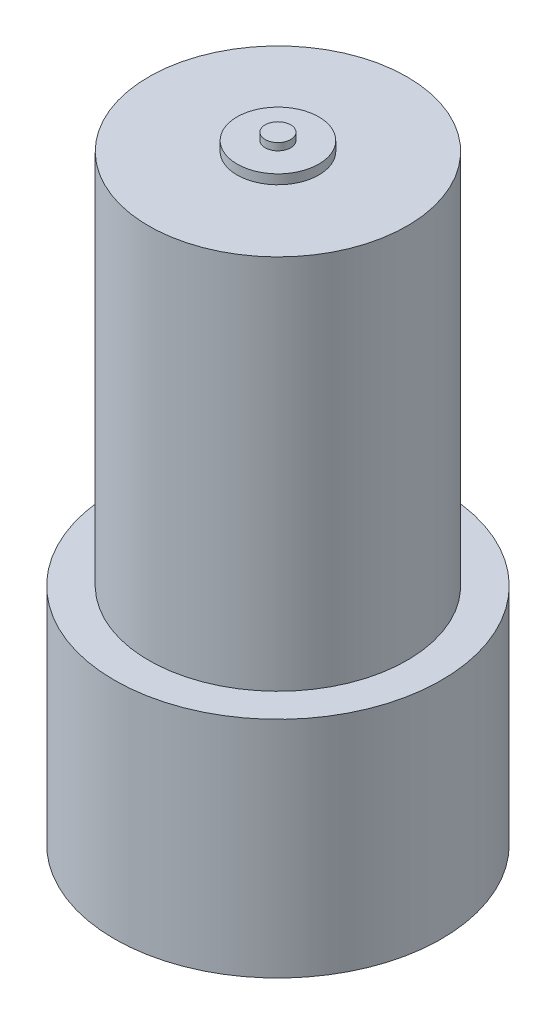
ISO-10303-21;
HEADER;
FILE_DESCRIPTION(('STEP AP214'),'2;1');
FILE_NAME('part.step','',(''),(''),'','','');
FILE_SCHEMA(('AUTOMOTIVE_DESIGN { 1 0 10303 214 1 1 1 1 }'));
ENDSEC;
DATA;
#1=APPLICATION_CONTEXT('core data for automotive mechanical design processes');
#2=APPLICATION_PROTOCOL_DEFINITION('international standard','automotive_design',2000,#1);
#3=PRODUCT_CONTEXT('',#1,'mechanical');
#4=PRODUCT('Part','Part','',(#3));
#5=PRODUCT_RELATED_PRODUCT_CATEGORY('part','',(#4));
#6=PRODUCT_DEFINITION_FORMATION('','',#4);
#7=PRODUCT_DEFINITION_CONTEXT('part definition',#1,'design');
#8=PRODUCT_DEFINITION('design','',#6,#7);
#9=PRODUCT_DEFINITION_SHAPE('','',#8);
#10=(LENGTH_UNIT() NAMED_UNIT(*) SI_UNIT(.MILLI.,.METRE.));
#11=(NAMED_UNIT(*) PLANE_ANGLE_UNIT() SI_UNIT($,.RADIAN.));
#12=(NAMED_UNIT(*) SI_UNIT($,.STERADIAN.) SOLID_ANGLE_UNIT());
#13=UNCERTAINTY_MEASURE_WITH_UNIT(LENGTH_MEASURE(1.E-05),#10,'distance_accuracy_value','');
#14=(GEOMETRIC_REPRESENTATION_CONTEXT(3) GLOBAL_UNCERTAINTY_ASSIGNED_CONTEXT((#13)) GLOBAL_UNIT_ASSIGNED_CONTEXT((#10,
#11,#12)) REPRESENTATION_CONTEXT('',''));
#15=CARTESIAN_POINT('',(0.,0.,0.));
#16=DIRECTION('',(0.,0.,1.));
#17=DIRECTION('',(1.,0.,0.));
#18=AXIS2_PLACEMENT_3D('',#15,#16,#17);
#19=CARTESIAN_POINT('',(0.,-1.524,0.));
#20=DIRECTION('',(0.,-1.,0.));
#21=DIRECTION('',(0.,0.,-1.));
#22=AXIS2_PLACEMENT_3D('',#19,#20,#21);
#23=PLANE('',#22);
#24=CARTESIAN_POINT('',(0.,-1.524,0.));
#25=DIRECTION('',(0.,-1.,0.));
#26=DIRECTION('',(0.,0.,-1.));
#27=AXIS2_PLACEMENT_3D('',#24,#25,#26);
#28=CIRCLE('',#27,14.224);
#29=CARTESIAN_POINT('',(0.,-1.524,14.224));
#30=VERTEX_POINT('',#29);
#31=EDGE_CURVE('E83',#30,#30,#28,.T.);
#32=ORIENTED_EDGE('',*,*,#31,.T.);
#33=EDGE_LOOP('',(#32));
#34=FACE_BOUND('',#33,.T.);
#35=CARTESIAN_POINT('',(-4.1783,-1.524,0.));
#36=DIRECTION('',(0.,-1.,0.));
#37=DIRECTION('',(0.,0.,-1.));
#38=AXIS2_PLACEMENT_3D('',#35,#36,#37);
#39=CIRCLE('',#38,2.9464);
#40=CARTESIAN_POINT('',(-4.1783,-1.524,-2.9464));
#41=VERTEX_POINT('',#40);
#42=EDGE_CURVE('E38',#41,#41,#39,.F.);
#43=ORIENTED_EDGE('',*,*,#42,.T.);
#44=EDGE_LOOP('',(#43));
#45=FACE_BOUND('',#44,.T.);
#46=ADVANCED_FACE('F34',(#34,#45),#23,.T.);
#47=CARTESIAN_POINT('',(0.,94.6912,0.));
#48=DIRECTION('',(0.,1.,0.));
#49=DIRECTION('',(0.,0.,1.));
#50=AXIS2_PLACEMENT_3D('',#47,#48,#49);
#51=PLANE('',#50);
#52=CARTESIAN_POINT('',(0.,94.6912,0.));
#53=DIRECTION('',(0.,1.,0.));
#54=DIRECTION('',(0.,0.,1.));
#55=AXIS2_PLACEMENT_3D('',#52,#53,#54);
#56=CIRCLE('',#55,6.35);
#57=CARTESIAN_POINT('',(0.,94.6912,6.35));
#58=VERTEX_POINT('',#57);
#59=EDGE_CURVE('E80',#58,#58,#56,.T.);
#60=ORIENTED_EDGE('',*,*,#59,.T.);
#61=EDGE_LOOP('',(#60));
#62=FACE_BOUND('',#61,.T.);
#63=CARTESIAN_POINT('',(0.,94.6912,0.));
#64=DIRECTION('',(0.,1.,0.));
#65=DIRECTION('',(0.,0.,1.));
#66=AXIS2_PLACEMENT_3D('',#63,#64,#65);
#67=CIRCLE('',#66,1.9812);
#68=CARTESIAN_POINT('',(0.,94.6912,1.9812));
#69=VERTEX_POINT('',#68);
#70=EDGE_CURVE('E77',#69,#69,#67,.T.);
#71=ORIENTED_EDGE('',*,*,#70,.F.);
#72=EDGE_LOOP('',(#71));
#73=FACE_BOUND('',#72,.T.);
#74=ADVANCED_FACE('F128',(#62,#73),#51,.T.);
#75=CARTESIAN_POINT('',(0.,93.218,0.));
#76=DIRECTION('',(0.,1.,0.));
#77=DIRECTION('',(0.,0.,1.));
#78=AXIS2_PLACEMENT_3D('',#75,#76,#77);
#79=PLANE('',#78);
#80=CARTESIAN_POINT('',(0.,93.218,0.));
#81=DIRECTION('',(0.,1.,0.));
#82=DIRECTION('',(0.,0.,1.));
#83=AXIS2_PLACEMENT_3D('',#80,#81,#82);
#84=CIRCLE('',#83,20.066);
#85=CARTESIAN_POINT('',(0.,93.218,-20.066));
#86=VERTEX_POINT('',#85);
#87=EDGE_CURVE('E89',#86,#86,#84,.T.);
#88=ORIENTED_EDGE('',*,*,#87,.T.);
#89=EDGE_LOOP('',(#88));
#90=FACE_BOUND('',#89,.T.);
#91=CARTESIAN_POINT('',(0.,93.218,0.));
#92=DIRECTION('',(0.,1.,0.));
#93=DIRECTION('',(0.,0.,1.));
#94=AXIS2_PLACEMENT_3D('',#91,#92,#93);
#95=CIRCLE('',#94,6.35);
#96=CARTESIAN_POINT('',(0.,93.218,6.35));
#97=VERTEX_POINT('',#96);
#98=EDGE_CURVE('E76',#97,#97,#95,.T.);
#99=ORIENTED_EDGE('',*,*,#98,.F.);
#100=EDGE_LOOP('',(#99));
#101=FACE_BOUND('',#100,.T.);
#102=ADVANCED_FACE('F105',(#90,#101),#79,.T.);
#103=CARTESIAN_POINT('',(0.,0.,0.));
#104=DIRECTION('',(0.,1.,0.));
#105=DIRECTION('',(0.,0.,1.));
#106=AXIS2_PLACEMENT_3D('',#103,#104,#105);
#107=PLANE('',#106);
#108=CARTESIAN_POINT('',(0.,0.,19.05));
#109=DIRECTION('',(0.,-1.,0.));
#110=DIRECTION('',(0.,0.,-1.));
#111=AXIS2_PLACEMENT_3D('',#108,#109,#110);
#112=CIRCLE('',#111,2.0193);
#113=CARTESIAN_POINT('',(0.,0.,17.0307));
#114=VERTEX_POINT('',#113);
#115=EDGE_CURVE('E60',#114,#114,#112,.T.);
#116=ORIENTED_EDGE('',*,*,#115,.F.);
#117=EDGE_LOOP('',(#116));
#118=FACE_BOUND('',#117,.T.);
#119=CARTESIAN_POINT('',(0.,0.,-19.05));
#120=DIRECTION('',(0.,-1.,0.));
#121=DIRECTION('',(0.,0.,-1.));
#122=AXIS2_PLACEMENT_3D('',#119,#120,#121);
#123=CIRCLE('',#122,2.0193);
#124=CARTESIAN_POINT('',(0.,0.,-21.0693));
#125=VERTEX_POINT('',#124);
#126=EDGE_CURVE('E59',#125,#125,#123,.T.);
#127=ORIENTED_EDGE('',*,*,#126,.F.);
#128=EDGE_LOOP('',(#127));
#129=FACE_BOUND('',#128,.T.);
#130=CARTESIAN_POINT('',(0.,0.,0.));
#131=DIRECTION('',(0.,1.,0.));
#132=DIRECTION('',(0.,0.,1.));
#133=AXIS2_PLACEMENT_3D('',#130,#131,#132);
#134=CIRCLE('',#133,25.4);
#135=CARTESIAN_POINT('',(0.,0.,25.4));
#136=VERTEX_POINT('',#135);
#137=EDGE_CURVE('E92',#136,#136,#134,.T.);
#138=ORIENTED_EDGE('',*,*,#137,.F.);
#139=EDGE_LOOP('',(#138));
#140=FACE_BOUND('',#139,.T.);
#141=CARTESIAN_POINT('',(0.,0.,0.));
#142=DIRECTION('',(0.,1.,0.));
#143=DIRECTION('',(0.,0.,1.));
#144=AXIS2_PLACEMENT_3D('',#141,#142,#143);
#145=CIRCLE('',#144,14.224);
#146=CARTESIAN_POINT('',(0.,0.,14.224));
#147=VERTEX_POINT('',#146);
#148=EDGE_CURVE('E11',#147,#147,#145,.F.);
#149=ORIENTED_EDGE('',*,*,#148,.F.);
#150=EDGE_LOOP('',(#149));
#151=FACE_BOUND('',#150,.T.);
#152=ADVANCED_FACE('F101',(#118,#129,#140,#151),#107,.F.);
#153=CARTESIAN_POINT('',(0.,34.798,0.));
#154=DIRECTION('',(0.,1.,0.));
#155=DIRECTION('',(0.,0.,1.));
#156=AXIS2_PLACEMENT_3D('',#153,#154,#155);
#157=PLANE('',#156);
#158=CARTESIAN_POINT('',(0.,34.798,0.));
#159=DIRECTION('',(0.,1.,0.));
#160=DIRECTION('',(0.,0.,1.));
#161=AXIS2_PLACEMENT_3D('',#158,#159,#160);
#162=CIRCLE('',#161,25.4);
#163=CARTESIAN_POINT('',(0.,34.798,25.4));
#164=VERTEX_POINT('',#163);
#165=EDGE_CURVE('E43',#164,#164,#162,.T.);
#166=ORIENTED_EDGE('',*,*,#165,.T.);
#167=EDGE_LOOP('',(#166));
#168=FACE_BOUND('',#167,.T.);
#169=CARTESIAN_POINT('',(0.,34.798,0.));
#170=DIRECTION('',(0.,1.,0.));
#171=DIRECTION('',(0.,0.,1.));
#172=AXIS2_PLACEMENT_3D('',#169,#170,#171);
#173=CIRCLE('',#172,20.066);
#174=CARTESIAN_POINT('',(0.,34.798,-20.066));
#175=VERTEX_POINT('',#174);
#176=EDGE_CURVE('E88',#175,#175,#173,.T.);
#177=ORIENTED_EDGE('',*,*,#176,.F.);
#178=EDGE_LOOP('',(#177));
#179=FACE_BOUND('',#178,.T.);
#180=ADVANCED_FACE('F104',(#168,#179),#157,.T.);
#181=CARTESIAN_POINT('',(0.,34.798,0.));
#182=DIRECTION('',(0.,-1.,0.));
#183=DIRECTION('',(0.,0.,-1.));
#184=AXIS2_PLACEMENT_3D('',#181,#182,#183);
#185=CYLINDRICAL_SURFACE('',#184,25.4);
#186=ORIENTED_EDGE('',*,*,#165,.F.);
#187=EDGE_LOOP('',(#186));
#188=FACE_BOUND('',#187,.T.);
#189=ORIENTED_EDGE('',*,*,#137,.T.);
#190=EDGE_LOOP('',(#189));
#191=FACE_BOUND('',#190,.T.);
#192=ADVANCED_FACE('F36',(#188,#191),#185,.T.);
#193=CARTESIAN_POINT('',(0.,93.218,0.));
#194=DIRECTION('',(0.,-1.,0.));
#195=DIRECTION('',(0.,0.,-1.));
#196=AXIS2_PLACEMENT_3D('',#193,#194,#195);
#197=CYLINDRICAL_SURFACE('',#196,20.066);
#198=CARTESIAN_POINT('',(0.,93.218,-20.066));
#199=CARTESIAN_POINT('',(0.,92.6094583333333,-20.066));
#200=CARTESIAN_POINT('',(0.,92.0009166666667,-20.066));
#201=CARTESIAN_POINT('',(0.,90.7838333333333,-20.066));
#202=CARTESIAN_POINT('',(0.,90.1752916666667,-20.066));
#203=CARTESIAN_POINT('',(0.,88.9582083333333,-20.066));
#204=CARTESIAN_POINT('',(0.,88.3496666666667,-20.066));
#205=CARTESIAN_POINT('',(0.,87.1325833333333,-20.066));
#206=CARTESIAN_POINT('',(0.,86.5240416666667,-20.066));
#207=CARTESIAN_POINT('',(0.,85.3069583333333,-20.066));
#208=CARTESIAN_POINT('',(0.,84.6984166666667,-20.066));
#209=CARTESIAN_POINT('',(0.,83.4813333333333,-20.066));
#210=CARTESIAN_POINT('',(0.,82.8727916666667,-20.066));
#211=CARTESIAN_POINT('',(0.,81.6557083333333,-20.066));
#212=CARTESIAN_POINT('',(0.,81.0471666666667,-20.066));
#213=CARTESIAN_POINT('',(0.,79.8300833333333,-20.066));
#214=CARTESIAN_POINT('',(0.,79.2215416666667,-20.066));
#215=CARTESIAN_POINT('',(0.,78.0044583333333,-20.066));
#216=CARTESIAN_POINT('',(0.,77.3959166666667,-20.066));
#217=CARTESIAN_POINT('',(0.,76.1788333333333,-20.066));
#218=CARTESIAN_POINT('',(0.,75.5702916666667,-20.066));
#219=CARTESIAN_POINT('',(0.,74.3532083333333,-20.066));
#220=CARTESIAN_POINT('',(0.,73.7446666666667,-20.066));
#221=CARTESIAN_POINT('',(0.,72.5275833333333,-20.066));
#222=CARTESIAN_POINT('',(0.,71.9190416666667,-20.066));
#223=CARTESIAN_POINT('',(0.,70.7019583333333,-20.066));
#224=CARTESIAN_POINT('',(0.,70.0934166666667,-20.066));
#225=CARTESIAN_POINT('',(0.,68.8763333333333,-20.066));
#226=CARTESIAN_POINT('',(0.,68.2677916666667,-20.066));
#227=CARTESIAN_POINT('',(0.,67.0507083333333,-20.066));
#228=CARTESIAN_POINT('',(0.,66.4421666666667,-20.066));
#229=CARTESIAN_POINT('',(0.,65.2250833333333,-20.066));
#230=CARTESIAN_POINT('',(0.,64.6165416666667,-20.066));
#231=CARTESIAN_POINT('',(0.,63.3994583333333,-20.066));
#232=CARTESIAN_POINT('',(0.,62.7909166666667,-20.066));
#233=CARTESIAN_POINT('',(0.,61.5738333333333,-20.066));
#234=CARTESIAN_POINT('',(0.,60.9652916666667,-20.066));
#235=CARTESIAN_POINT('',(0.,59.7482083333333,-20.066));
#236=CARTESIAN_POINT('',(0.,59.1396666666667,-20.066));
#237=CARTESIAN_POINT('',(0.,57.9225833333333,-20.066));
#238=CARTESIAN_POINT('',(0.,57.3140416666667,-20.066));
#239=CARTESIAN_POINT('',(0.,56.0969583333333,-20.066));
#240=CARTESIAN_POINT('',(0.,55.4884166666667,-20.066));
#241=CARTESIAN_POINT('',(0.,54.2713333333333,-20.066));
#242=CARTESIAN_POINT('',(0.,53.6627916666667,-20.066));
#243=CARTESIAN_POINT('',(0.,52.4457083333333,-20.066));
#244=CARTESIAN_POINT('',(0.,51.8371666666667,-20.066));
#245=CARTESIAN_POINT('',(0.,50.6200833333333,-20.066));
#246=CARTESIAN_POINT('',(0.,50.0115416666667,-20.066));
#247=CARTESIAN_POINT('',(0.,48.7944583333333,-20.066));
#248=CARTESIAN_POINT('',(0.,48.1859166666667,-20.066));
#249=CARTESIAN_POINT('',(0.,46.9688333333333,-20.066));
#250=CARTESIAN_POINT('',(0.,46.3602916666667,-20.066));
#251=CARTESIAN_POINT('',(0.,45.1432083333333,-20.066));
#252=CARTESIAN_POINT('',(0.,44.5346666666667,-20.066));
#253=CARTESIAN_POINT('',(0.,43.3175833333333,-20.066));
#254=CARTESIAN_POINT('',(0.,42.7090416666667,-20.066));
#255=CARTESIAN_POINT('',(0.,41.4919583333333,-20.066));
#256=CARTESIAN_POINT('',(0.,40.8834166666667,-20.066));
#257=CARTESIAN_POINT('',(0.,39.6663333333333,-20.066));
#258=CARTESIAN_POINT('',(0.,39.0577916666667,-20.066));
#259=CARTESIAN_POINT('',(0.,37.8407083333333,-20.066));
#260=CARTESIAN_POINT('',(0.,37.2321666666667,-20.066));
#261=CARTESIAN_POINT('',(0.,36.0150833333333,-20.066));
#262=CARTESIAN_POINT('',(0.,35.4065416666667,-20.066));
#263=CARTESIAN_POINT('',(0.,34.798,-20.066));
#264=B_SPLINE_CURVE_WITH_KNOTS('',3,(#198,#199,#200,#201,#202,#203,#204,#205,#206,#207,#208,
#209,#210,#211,#212,#213,#214,#215,#216,#217,#218,#219,#220,#221,#222,#223,#224,#225,#226,#227,
#228,#229,#230,#231,#232,#233,#234,#235,#236,#237,#238,#239,#240,#241,#242,#243,#244,#245,#246,
#247,#248,#249,#250,#251,#252,#253,#254,#255,#256,#257,#258,#259,#260,#261,#262,#263),
.UNSPECIFIED.,.F.,.F.,(4,2,2,2,2,2,2,2,2,2,2,2,2,2,2,2,2,2,2,2,2,2,2,2,2,2,2,2,2,2,2,2,4),(0.,
1.82562500000001,3.65125000000001,5.47687500000001,7.3025,9.128125,10.95375,12.779375,14.605,
16.430625,18.25625,20.081875,21.9075,23.733125,25.55875,27.384375,29.21,31.035625,32.86125,
34.686875,36.5125,38.338125,40.16375,41.989375,43.815,45.640625,47.46625,49.291875,51.1175,
52.943125,54.76875,56.594375,58.42),.UNSPECIFIED.);
#265=EDGE_CURVE('BSEAM112',#86,#175,#264,.T.);
#266=ORIENTED_EDGE('',*,*,#87,.F.);
#267=ORIENTED_EDGE('',*,*,#176,.T.);
#268=ORIENTED_EDGE('',*,*,#265,.T.);
#269=ORIENTED_EDGE('',*,*,#265,.F.);
#270=EDGE_LOOP('',(#266,#268,#267,#269));
#271=FACE_BOUND('',#270,.T.);
#272=ADVANCED_FACE('F112',(#271),#197,.T.);
#273=CARTESIAN_POINT('',(0.,-1.524,0.));
#274=DIRECTION('',(0.,1.,0.));
#275=DIRECTION('',(0.,0.,1.));
#276=AXIS2_PLACEMENT_3D('',#273,#274,#275);
#277=CYLINDRICAL_SURFACE('',#276,14.224);
#278=CARTESIAN_POINT('',(0.,-1.524,14.224));
#279=CARTESIAN_POINT('',(0.,-1.508125,14.224));
#280=CARTESIAN_POINT('',(0.,-1.49225,14.224));
#281=CARTESIAN_POINT('',(0.,-1.4605,14.224));
#282=CARTESIAN_POINT('',(0.,-1.444625,14.224));
#283=CARTESIAN_POINT('',(0.,-1.412875,14.224));
#284=CARTESIAN_POINT('',(0.,-1.397,14.224));
#285=CARTESIAN_POINT('',(0.,-1.36525,14.224));
#286=CARTESIAN_POINT('',(0.,-1.349375,14.224));
#287=CARTESIAN_POINT('',(0.,-1.317625,14.224));
#288=CARTESIAN_POINT('',(0.,-1.30175,14.224));
#289=CARTESIAN_POINT('',(0.,-1.27,14.224));
#290=CARTESIAN_POINT('',(0.,-1.254125,14.224));
#291=CARTESIAN_POINT('',(0.,-1.222375,14.224));
#292=CARTESIAN_POINT('',(0.,-1.2065,14.224));
#293=CARTESIAN_POINT('',(0.,-1.17475,14.224));
#294=CARTESIAN_POINT('',(0.,-1.158875,14.224));
#295=CARTESIAN_POINT('',(0.,-1.127125,14.224));
#296=CARTESIAN_POINT('',(0.,-1.11125,14.224));
#297=CARTESIAN_POINT('',(0.,-1.0795,14.224));
#298=CARTESIAN_POINT('',(0.,-1.063625,14.224));
#299=CARTESIAN_POINT('',(0.,-1.031875,14.224));
#300=CARTESIAN_POINT('',(0.,-1.016,14.224));
#301=CARTESIAN_POINT('',(0.,-0.98425,14.224));
#302=CARTESIAN_POINT('',(0.,-0.968375,14.224));
#303=CARTESIAN_POINT('',(0.,-0.936625,14.224));
#304=CARTESIAN_POINT('',(0.,-0.92075,14.224));
#305=CARTESIAN_POINT('',(0.,-0.889,14.224));
#306=CARTESIAN_POINT('',(0.,-0.873125,14.224));
#307=CARTESIAN_POINT('',(0.,-0.841375,14.224));
#308=CARTESIAN_POINT('',(0.,-0.8255,14.224));
#309=CARTESIAN_POINT('',(0.,-0.79375,14.224));
#310=CARTESIAN_POINT('',(0.,-0.777875,14.224));
#311=CARTESIAN_POINT('',(0.,-0.746125,14.224));
#312=CARTESIAN_POINT('',(0.,-0.73025,14.224));
#313=CARTESIAN_POINT('',(0.,-0.6985,14.224));
#314=CARTESIAN_POINT('',(0.,-0.682625,14.224));
#315=CARTESIAN_POINT('',(0.,-0.650875,14.224));
#316=CARTESIAN_POINT('',(0.,-0.635,14.224));
#317=CARTESIAN_POINT('',(0.,-0.60325,14.224));
#318=CARTESIAN_POINT('',(0.,-0.587375,14.224));
#319=CARTESIAN_POINT('',(0.,-0.555625,14.224));
#320=CARTESIAN_POINT('',(0.,-0.53975,14.224));
#321=CARTESIAN_POINT('',(0.,-0.508,14.224));
#322=CARTESIAN_POINT('',(0.,-0.492125,14.224));
#323=CARTESIAN_POINT('',(0.,-0.460375,14.224));
#324=CARTESIAN_POINT('',(0.,-0.4445,14.224));
#325=CARTESIAN_POINT('',(0.,-0.41275,14.224));
#326=CARTESIAN_POINT('',(0.,-0.396875,14.224));
#327=CARTESIAN_POINT('',(0.,-0.365125,14.224));
#328=CARTESIAN_POINT('',(0.,-0.34925,14.224));
#329=CARTESIAN_POINT('',(0.,-0.3175,14.224));
#330=CARTESIAN_POINT('',(0.,-0.301625,14.224));
#331=CARTESIAN_POINT('',(0.,-0.269875,14.224));
#332=CARTESIAN_POINT('',(0.,-0.254,14.224));
#333=CARTESIAN_POINT('',(0.,-0.22225,14.224));
#334=CARTESIAN_POINT('',(0.,-0.206375,14.224));
#335=CARTESIAN_POINT('',(0.,-0.174625,14.224));
#336=CARTESIAN_POINT('',(0.,-0.15875,14.224));
#337=CARTESIAN_POINT('',(0.,-0.127,14.224));
#338=CARTESIAN_POINT('',(0.,-0.111125,14.224));
#339=CARTESIAN_POINT('',(0.,-0.079375,14.224));
#340=CARTESIAN_POINT('',(0.,-0.0635,14.224));
#341=CARTESIAN_POINT('',(0.,-0.0317499999999999,14.224));
#342=CARTESIAN_POINT('',(0.,-0.015875,14.224));
#343=CARTESIAN_POINT('',(0.,0.,14.224));
#344=B_SPLINE_CURVE_WITH_KNOTS('',3,(#278,#279,#280,#281,#282,#283,#284,#285,#286,#287,#288,
#289,#290,#291,#292,#293,#294,#295,#296,#297,#298,#299,#300,#301,#302,#303,#304,#305,#306,#307,
#308,#309,#310,#311,#312,#313,#314,#315,#316,#317,#318,#319,#320,#321,#322,#323,#324,#325,#326,
#327,#328,#329,#330,#331,#332,#333,#334,#335,#336,#337,#338,#339,#340,#341,#342,#343),
.UNSPECIFIED.,.F.,.F.,(4,2,2,2,2,2,2,2,2,2,2,2,2,2,2,2,2,2,2,2,2,2,2,2,2,2,2,2,2,2,2,2,4),(0.,
0.0476249999999999,0.0952499999999998,0.142875,0.1905,0.238125,0.28575,0.333375,0.381,0.428625,
0.47625,0.523875,0.5715,0.619125,0.66675,0.714375,0.762,0.809625,0.85725,0.904875,0.9525,
1.000125,1.04775,1.095375,1.143,1.190625,1.23825,1.285875,1.3335,1.381125,1.42875,1.476375,
1.524),.UNSPECIFIED.);
#345=EDGE_CURVE('BSEAM109',#30,#147,#344,.T.);
#346=ORIENTED_EDGE('',*,*,#31,.F.);
#347=ORIENTED_EDGE('',*,*,#148,.T.);
#348=ORIENTED_EDGE('',*,*,#345,.T.);
#349=ORIENTED_EDGE('',*,*,#345,.F.);
#350=EDGE_LOOP('',(#346,#348,#347,#349));
#351=FACE_BOUND('',#350,.T.);
#352=ADVANCED_FACE('F109',(#351),#277,.T.);
#353=CARTESIAN_POINT('',(0.,94.6912,0.));
#354=DIRECTION('',(0.,-1.,0.));
#355=DIRECTION('',(0.,0.,-1.));
#356=AXIS2_PLACEMENT_3D('',#353,#354,#355);
#357=CYLINDRICAL_SURFACE('',#356,6.35);
#358=ORIENTED_EDGE('',*,*,#59,.F.);
#359=EDGE_LOOP('',(#358));
#360=FACE_BOUND('',#359,.T.);
#361=ORIENTED_EDGE('',*,*,#98,.T.);
#362=EDGE_LOOP('',(#361));
#363=FACE_BOUND('',#362,.T.);
#364=ADVANCED_FACE('F111',(#360,#363),#357,.T.);
#365=CARTESIAN_POINT('',(0.,95.8088,0.));
#366=DIRECTION('',(0.,-1.,0.));
#367=DIRECTION('',(0.,0.,-1.));
#368=AXIS2_PLACEMENT_3D('',#365,#366,#367);
#369=CYLINDRICAL_SURFACE('',#368,1.9812);
#370=CARTESIAN_POINT('',(0.,95.8088,0.));
#371=DIRECTION('',(0.,1.,0.));
#372=DIRECTION('',(0.,0.,1.));
#373=AXIS2_PLACEMENT_3D('',#370,#371,#372);
#374=CIRCLE('',#373,1.9812);
#375=CARTESIAN_POINT('',(0.,95.8088,1.9812));
#376=VERTEX_POINT('',#375);
#377=EDGE_CURVE('E73',#376,#376,#374,.T.);
#378=ORIENTED_EDGE('',*,*,#377,.F.);
#379=EDGE_LOOP('',(#378));
#380=FACE_BOUND('',#379,.T.);
#381=ORIENTED_EDGE('',*,*,#70,.T.);
#382=EDGE_LOOP('',(#381));
#383=FACE_BOUND('',#382,.T.);
#384=ADVANCED_FACE('F119',(#380,#383),#369,.T.);
#385=CARTESIAN_POINT('',(0.,95.8088,0.));
#386=DIRECTION('',(0.,1.,0.));
#387=DIRECTION('',(0.,0.,1.));
#388=AXIS2_PLACEMENT_3D('',#385,#386,#387);
#389=PLANE('',#388);
#390=ORIENTED_EDGE('',*,*,#377,.T.);
#391=EDGE_LOOP('',(#390));
#392=FACE_BOUND('',#391,.T.);
#393=ADVANCED_FACE('F139',(#392),#389,.T.);
#394=CARTESIAN_POINT('',(-4.1783,-17.526,0.));
#395=DIRECTION('',(0.,1.,0.));
#396=DIRECTION('',(0.,0.,1.));
#397=AXIS2_PLACEMENT_3D('',#394,#395,#396);
#398=CYLINDRICAL_SURFACE('',#397,2.9464);
#399=ORIENTED_EDGE('',*,*,#42,.F.);
#400=EDGE_LOOP('',(#399));
#401=FACE_BOUND('',#400,.T.);
#402=CARTESIAN_POINT('',(-4.1783,-17.526,0.));
#403=DIRECTION('',(0.,-1.,0.));
#404=DIRECTION('',(0.,0.,-1.));
#405=AXIS2_PLACEMENT_3D('',#402,#403,#404);
#406=CIRCLE('',#405,2.9464);
#407=CARTESIAN_POINT('',(-4.1783,-17.526,-2.9464));
#408=VERTEX_POINT('',#407);
#409=EDGE_CURVE('E70',#408,#408,#406,.T.);
#410=ORIENTED_EDGE('',*,*,#409,.F.);
#411=EDGE_LOOP('',(#410));
#412=FACE_BOUND('',#411,.T.);
#413=ADVANCED_FACE('F143',(#401,#412),#398,.T.);
#414=CARTESIAN_POINT('',(-4.1783,-17.526,0.));
#415=DIRECTION('',(0.,-1.,0.));
#416=DIRECTION('',(0.,0.,-1.));
#417=AXIS2_PLACEMENT_3D('',#414,#415,#416);
#418=PLANE('',#417);
#419=ORIENTED_EDGE('',*,*,#409,.T.);
#420=EDGE_LOOP('',(#419));
#421=FACE_BOUND('',#420,.T.);
#422=ADVANCED_FACE('F147',(#421),#418,.T.);
#423=CARTESIAN_POINT('',(0.,6.35,-19.05));
#424=DIRECTION('',(0.,-1.,0.));
#425=DIRECTION('',(0.,0.,-1.));
#426=AXIS2_PLACEMENT_3D('',#423,#424,#425);
#427=CONICAL_SURFACE('',#426,2.0193,1.02974425867665);
#428=CARTESIAN_POINT('',(0.,7.56331784800235,-19.05));
#429=VERTEX_POINT('',#428);
#430=VERTEX_LOOP('',#429);
#431=FACE_BOUND('',#430,.T.);
#432=CARTESIAN_POINT('',(0.,6.35,-19.05));
#433=DIRECTION('',(0.,-1.,0.));
#434=DIRECTION('',(0.,0.,-1.));
#435=AXIS2_PLACEMENT_3D('',#432,#433,#434);
#436=CIRCLE('',#435,2.0193);
#437=CARTESIAN_POINT('',(0.,6.35,-21.0693));
#438=VERTEX_POINT('',#437);
#439=EDGE_CURVE('E63',#438,#438,#436,.T.);
#440=ORIENTED_EDGE('',*,*,#439,.T.);
#441=EDGE_LOOP('',(#440));
#442=FACE_BOUND('',#441,.T.);
#443=ADVANCED_FACE('F151',(#431,#442),#427,.F.);
#444=CARTESIAN_POINT('',(0.,0.,-19.05));
#445=DIRECTION('',(0.,-1.,0.));
#446=DIRECTION('',(0.,0.,-1.));
#447=AXIS2_PLACEMENT_3D('',#444,#445,#446);
#448=CYLINDRICAL_SURFACE('',#447,2.0193);
#449=ORIENTED_EDGE('',*,*,#439,.F.);
#450=EDGE_LOOP('',(#449));
#451=FACE_BOUND('',#450,.T.);
#452=ORIENTED_EDGE('',*,*,#126,.T.);
#453=EDGE_LOOP('',(#452));
#454=FACE_BOUND('',#453,.T.);
#455=ADVANCED_FACE('F53',(#451,#454),#448,.F.);
#456=CARTESIAN_POINT('',(0.,6.35,19.05));
#457=DIRECTION('',(0.,-1.,0.));
#458=DIRECTION('',(0.,0.,-1.));
#459=AXIS2_PLACEMENT_3D('',#456,#457,#458);
#460=CONICAL_SURFACE('',#459,2.0193,1.02974425867665);
#461=CARTESIAN_POINT('',(0.,7.56331784800235,19.05));
#462=VERTEX_POINT('',#461);
#463=VERTEX_LOOP('',#462);
#464=FACE_BOUND('',#463,.T.);
#465=CARTESIAN_POINT('',(0.,6.35,19.05));
#466=DIRECTION('',(0.,-1.,0.));
#467=DIRECTION('',(0.,0.,-1.));
#468=AXIS2_PLACEMENT_3D('',#465,#466,#467);
#469=CIRCLE('',#468,2.0193);
#470=CARTESIAN_POINT('',(0.,6.35,17.0307));
#471=VERTEX_POINT('',#470);
#472=EDGE_CURVE('E57',#471,#471,#469,.T.);
#473=ORIENTED_EDGE('',*,*,#472,.T.);
#474=EDGE_LOOP('',(#473));
#475=FACE_BOUND('',#474,.T.);
#476=ADVANCED_FACE('F49',(#464,#475),#460,.F.);
#477=CARTESIAN_POINT('',(0.,0.,19.05));
#478=DIRECTION('',(0.,-1.,0.));
#479=DIRECTION('',(0.,0.,-1.));
#480=AXIS2_PLACEMENT_3D('',#477,#478,#479);
#481=CYLINDRICAL_SURFACE('',#480,2.0193);
#482=ORIENTED_EDGE('',*,*,#472,.F.);
#483=EDGE_LOOP('',(#482));
#484=FACE_BOUND('',#483,.T.);
#485=ORIENTED_EDGE('',*,*,#115,.T.);
#486=EDGE_LOOP('',(#485));
#487=FACE_BOUND('',#486,.T.);
#488=ADVANCED_FACE('F52',(#484,#487),#481,.F.);
#489=CLOSED_SHELL('',(#46,#74,#102,#152,#180,#192,#272,#352,#364,#384,#393,#413,#422,#443,#455,
#476,#488));
#490=MANIFOLD_SOLID_BREP('B2',#489);
#491=ADVANCED_BREP_SHAPE_REPRESENTATION('',(#18,#490),#14);
#492=SHAPE_DEFINITION_REPRESENTATION(#9,#491);
ENDSEC;
END-ISO-10303-21;
